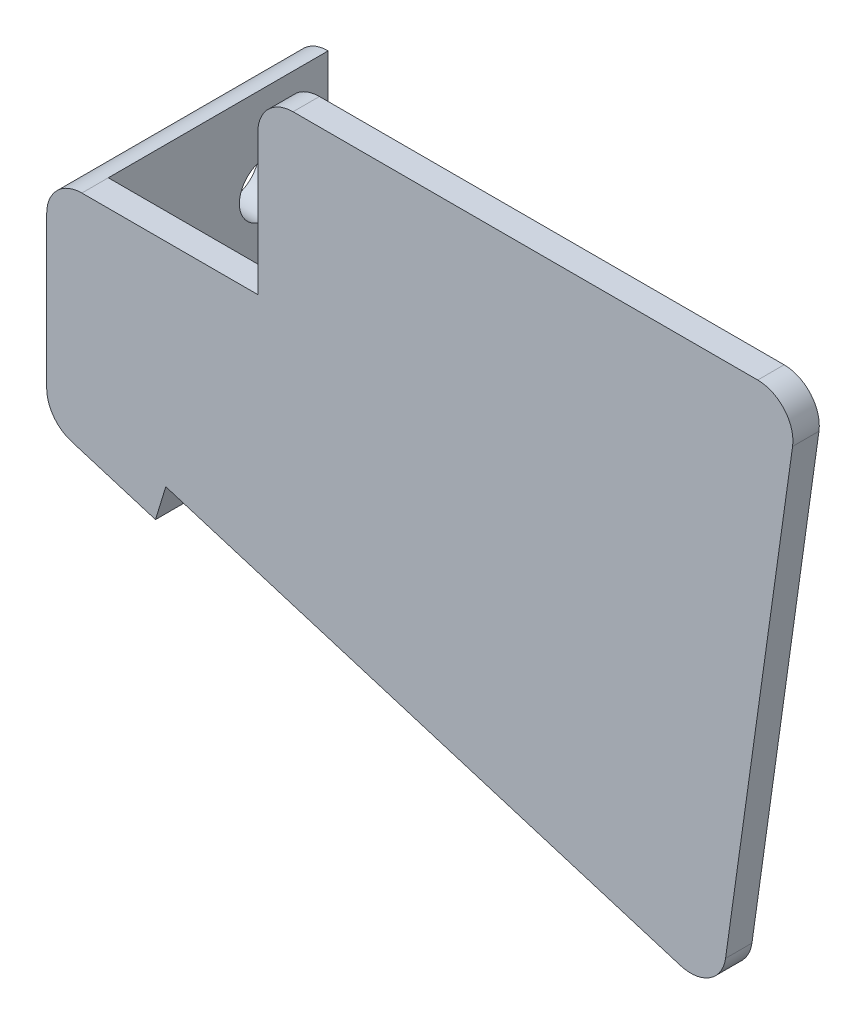
ISO-10303-21;
HEADER;
FILE_DESCRIPTION(('STEP AP214'),'2;1');
FILE_NAME('part.step','',(''),(''),'','','');
FILE_SCHEMA(('AUTOMOTIVE_DESIGN { 1 0 10303 214 1 1 1 1 }'));
ENDSEC;
DATA;
#1=APPLICATION_CONTEXT('core data for automotive mechanical design processes');
#2=APPLICATION_PROTOCOL_DEFINITION('international standard','automotive_design',2000,#1);
#3=PRODUCT_CONTEXT('',#1,'mechanical');
#4=PRODUCT('Part','Part','',(#3));
#5=PRODUCT_RELATED_PRODUCT_CATEGORY('part','',(#4));
#6=PRODUCT_DEFINITION_FORMATION('','',#4);
#7=PRODUCT_DEFINITION_CONTEXT('part definition',#1,'design');
#8=PRODUCT_DEFINITION('design','',#6,#7);
#9=PRODUCT_DEFINITION_SHAPE('','',#8);
#10=(LENGTH_UNIT() NAMED_UNIT(*) SI_UNIT(.MILLI.,.METRE.));
#11=(NAMED_UNIT(*) PLANE_ANGLE_UNIT() SI_UNIT($,.RADIAN.));
#12=(NAMED_UNIT(*) SI_UNIT($,.STERADIAN.) SOLID_ANGLE_UNIT());
#13=UNCERTAINTY_MEASURE_WITH_UNIT(LENGTH_MEASURE(1.E-05),#10,'distance_accuracy_value','');
#14=(GEOMETRIC_REPRESENTATION_CONTEXT(3) GLOBAL_UNCERTAINTY_ASSIGNED_CONTEXT((#13)) GLOBAL_UNIT_ASSIGNED_CONTEXT((#10,
#11,#12)) REPRESENTATION_CONTEXT('',''));
#15=CARTESIAN_POINT('',(0.,0.,0.));
#16=DIRECTION('',(0.,0.,1.));
#17=DIRECTION('',(1.,0.,0.));
#18=AXIS2_PLACEMENT_3D('',#15,#16,#17);
#19=CARTESIAN_POINT('',(-18.1517387774325,-12.72550419017,1.5));
#20=DIRECTION('',(1.,0.,0.));
#21=DIRECTION('',(0.,0.,-1.));
#22=AXIS2_PLACEMENT_3D('',#19,#20,#21);
#23=PLANE('',#22);
#24=CARTESIAN_POINT('',(-18.1517387774325,-17.72550419017,-9.));
#25=DIRECTION('',(1.,0.,0.));
#26=DIRECTION('',(0.,0.,-1.));
#27=AXIS2_PLACEMENT_3D('',#24,#25,#26);
#28=CIRCLE('',#27,1.55);
#29=CARTESIAN_POINT('',(-18.1517387774325,-17.72550419017,-10.55));
#30=VERTEX_POINT('',#29);
#31=EDGE_CURVE('E360',#30,#30,#28,.T.);
#32=ORIENTED_EDGE('',*,*,#31,.T.);
#33=EDGE_LOOP('',(#32));
#34=FACE_BOUND('',#33,.T.);
#35=DIRECTION('',(0.,-1.,0.));
#36=VECTOR('',#35,1.);
#37=CARTESIAN_POINT('',(-18.1517387774325,-12.72550419017,1.5));
#38=LINE('',#37,#36);
#39=CARTESIAN_POINT('',(-18.1517387774325,-14.72550419017,1.5));
#40=VERTEX_POINT('',#39);
#41=CARTESIAN_POINT('',(-18.1517387774325,-23.3369655530873,1.5));
#42=VERTEX_POINT('',#41);
#43=EDGE_CURVE('E199',#40,#42,#38,.T.);
#44=ORIENTED_EDGE('',*,*,#43,.F.);
#45=DIRECTION('',(0.,0.,-1.));
#46=VECTOR('',#45,1.);
#47=CARTESIAN_POINT('',(-18.1517387774325,-14.72550419017,1.5));
#48=LINE('',#47,#46);
#49=CARTESIAN_POINT('',(-18.1517387774325,-14.72550419017,-12.5));
#50=VERTEX_POINT('',#49);
#51=EDGE_CURVE('E252',#40,#50,#48,.T.);
#52=ORIENTED_EDGE('',*,*,#51,.T.);
#53=DIRECTION('',(0.,-1.,0.));
#54=VECTOR('',#53,1.);
#55=CARTESIAN_POINT('',(-18.1517387774325,-12.72550419017,-12.5));
#56=LINE('',#55,#54);
#57=CARTESIAN_POINT('',(-18.1517387774325,-23.3369655530873,-12.5));
#58=VERTEX_POINT('',#57);
#59=EDGE_CURVE('E183',#50,#58,#56,.T.);
#60=ORIENTED_EDGE('',*,*,#59,.T.);
#61=DIRECTION('',(0.,0.,1.));
#62=VECTOR('',#61,1.);
#63=CARTESIAN_POINT('',(-18.1517387774325,-23.3369655530873,1.5));
#64=LINE('',#63,#62);
#65=EDGE_CURVE('E248',#58,#42,#64,.T.);
#66=ORIENTED_EDGE('',*,*,#65,.T.);
#67=EDGE_LOOP('',(#44,#52,#60,#66));
#68=FACE_BOUND('',#67,.T.);
#69=ADVANCED_FACE('F45',(#34,#68),#23,.F.);
#70=CARTESIAN_POINT('',(-18.1517387774325,-22.72550419017,1.5));
#71=DIRECTION('',(0.292371704722734,0.956304755963036,0.));
#72=DIRECTION('',(-0.956304755963036,0.292371704722734,0.));
#73=AXIS2_PLACEMENT_3D('',#70,#71,#72);
#74=PLANE('',#73);
#75=DIRECTION('',(0.956304755963036,-0.292371704722734,0.));
#76=VECTOR('',#75,1.);
#77=CARTESIAN_POINT('',(-18.1517387774325,-22.72550419017,0.));
#78=LINE('',#77,#76);
#79=CARTESIAN_POINT('',(-11.3836912839954,-24.794703962483,0.));
#80=VERTEX_POINT('',#79);
#81=CARTESIAN_POINT('',(17.8610734439076,-33.7357258118429,0.));
#82=VERTEX_POINT('',#81);
#83=EDGE_CURVE('E224',#80,#82,#78,.T.);
#84=ORIENTED_EDGE('',*,*,#83,.T.);
#85=DIRECTION('',(0.,0.,-1.));
#86=VECTOR('',#85,1.);
#87=CARTESIAN_POINT('',(17.8610734439076,-33.7357258118429,1.5));
#88=LINE('',#87,#86);
#89=CARTESIAN_POINT('',(17.8610734439076,-33.7357258118429,1.5));
#90=VERTEX_POINT('',#89);
#91=EDGE_CURVE('E300',#82,#90,#88,.F.);
#92=ORIENTED_EDGE('',*,*,#91,.T.);
#93=DIRECTION('',(0.956304755963036,-0.292371704722734,0.));
#94=VECTOR('',#93,1.);
#95=CARTESIAN_POINT('',(-18.1517387774325,-22.72550419017,1.5));
#96=LINE('',#95,#94);
#97=CARTESIAN_POINT('',(-11.3836912839954,-24.794703962483,1.5));
#98=VERTEX_POINT('',#97);
#99=EDGE_CURVE('E203',#98,#90,#96,.T.);
#100=ORIENTED_EDGE('',*,*,#99,.F.);
#101=DIRECTION('',(0.,0.,1.));
#102=VECTOR('',#101,1.);
#103=CARTESIAN_POINT('',(-11.3836912839954,-24.794703962483,-12.5));
#104=LINE('',#103,#102);
#105=EDGE_CURVE('E188',#80,#98,#104,.T.);
#106=ORIENTED_EDGE('',*,*,#105,.F.);
#107=EDGE_LOOP('',(#84,#92,#100,#106));
#108=FACE_BOUND('',#107,.T.);
#109=ADVANCED_FACE('F397',(#108),#74,.F.);
#110=CARTESIAN_POINT('',(20.100451461089,-34.4203723790793,1.5));
#111=DIRECTION('',(-0.990268068741571,0.139173100960062,0.));
#112=DIRECTION('',(-0.139173100960062,-0.990268068741571,0.));
#113=AXIS2_PLACEMENT_3D('',#110,#111,#112);
#114=PLANE('',#113);
#115=DIRECTION('',(0.139173100960062,0.990268068741571,0.));
#116=VECTOR('',#115,1.);
#117=CARTESIAN_POINT('',(20.100451461089,-34.4203723790793,1.5));
#118=LINE('',#117,#116);
#119=CARTESIAN_POINT('',(20.4263529908362,-32.101462501837,1.5));
#120=VERTEX_POINT('',#119);
#121=CARTESIAN_POINT('',(24.2346740151816,-5.0038503920901,1.5));
#122=VERTEX_POINT('',#121);
#123=EDGE_CURVE('E208',#120,#122,#118,.T.);
#124=ORIENTED_EDGE('',*,*,#123,.F.);
#125=DIRECTION('',(0.,0.,-1.));
#126=VECTOR('',#125,1.);
#127=CARTESIAN_POINT('',(20.4263529908362,-32.101462501837,1.5));
#128=LINE('',#127,#126);
#129=CARTESIAN_POINT('',(20.4263529908362,-32.101462501837,0.));
#130=VERTEX_POINT('',#129);
#131=EDGE_CURVE('E289',#120,#130,#128,.T.);
#132=ORIENTED_EDGE('',*,*,#131,.T.);
#133=DIRECTION('',(0.139173100960062,0.990268068741571,0.));
#134=VECTOR('',#133,1.);
#135=CARTESIAN_POINT('',(20.100451461089,-34.4203723790793,0.));
#136=LINE('',#135,#134);
#137=CARTESIAN_POINT('',(24.2346740151816,-5.0038503920901,0.));
#138=VERTEX_POINT('',#137);
#139=EDGE_CURVE('E229',#130,#138,#136,.T.);
#140=ORIENTED_EDGE('',*,*,#139,.T.);
#141=DIRECTION('',(0.,0.,-1.));
#142=VECTOR('',#141,1.);
#143=CARTESIAN_POINT('',(24.2346740151816,-5.0038503920901,1.5));
#144=LINE('',#143,#142);
#145=EDGE_CURVE('E286',#138,#122,#144,.F.);
#146=ORIENTED_EDGE('',*,*,#145,.T.);
#147=EDGE_LOOP('',(#124,#132,#140,#146));
#148=FACE_BOUND('',#147,.T.);
#149=ADVANCED_FACE('F403',(#148),#114,.F.);
#150=CARTESIAN_POINT('',(-6.15173877743247,-2.72550419016997,1.5));
#151=DIRECTION('',(0.,-1.,0.));
#152=DIRECTION('',(1.,0.,0.));
#153=AXIS2_PLACEMENT_3D('',#150,#151,#152);
#154=PLANE('',#153);
#155=DIRECTION('',(-1.,0.,0.));
#156=VECTOR('',#155,1.);
#157=CARTESIAN_POINT('',(-6.15173877743247,-2.72550419016997,0.));
#158=LINE('',#157,#156);
#159=CARTESIAN_POINT('',(22.2541378776985,-2.72550419016997,0.));
#160=VERTEX_POINT('',#159);
#161=CARTESIAN_POINT('',(-4.15173877743247,-2.72550419016997,0.));
#162=VERTEX_POINT('',#161);
#163=EDGE_CURVE('E233',#160,#162,#158,.T.);
#164=ORIENTED_EDGE('',*,*,#163,.T.);
#165=DIRECTION('',(0.,0.,-1.));
#166=VECTOR('',#165,1.);
#167=CARTESIAN_POINT('',(-4.15173877743247,-2.72550419016997,1.5));
#168=LINE('',#167,#166);
#169=CARTESIAN_POINT('',(-4.15173877743247,-2.72550419016997,1.5));
#170=VERTEX_POINT('',#169);
#171=EDGE_CURVE('E54',#162,#170,#168,.F.);
#172=ORIENTED_EDGE('',*,*,#171,.T.);
#173=DIRECTION('',(-1.,0.,0.));
#174=VECTOR('',#173,1.);
#175=CARTESIAN_POINT('',(-6.15173877743247,-2.72550419016997,1.5));
#176=LINE('',#175,#174);
#177=CARTESIAN_POINT('',(22.2541378776985,-2.72550419016997,1.5));
#178=VERTEX_POINT('',#177);
#179=EDGE_CURVE('E212',#178,#170,#176,.T.);
#180=ORIENTED_EDGE('',*,*,#179,.F.);
#181=DIRECTION('',(0.,0.,-1.));
#182=VECTOR('',#181,1.);
#183=CARTESIAN_POINT('',(22.2541378776985,-2.72550419016997,1.5));
#184=LINE('',#183,#182);
#185=EDGE_CURVE('E307',#178,#160,#184,.T.);
#186=ORIENTED_EDGE('',*,*,#185,.T.);
#187=EDGE_LOOP('',(#164,#172,#180,#186));
#188=FACE_BOUND('',#187,.T.);
#189=ADVANCED_FACE('F314',(#188),#154,.F.);
#190=CARTESIAN_POINT('',(-6.15173877743247,-2.72550419016997,1.5));
#191=DIRECTION('',(1.,0.,0.));
#192=DIRECTION('',(0.,1.,0.));
#193=AXIS2_PLACEMENT_3D('',#190,#191,#192);
#194=PLANE('',#193);
#195=DIRECTION('',(0.,-1.,0.));
#196=VECTOR('',#195,1.);
#197=CARTESIAN_POINT('',(-6.15173877743247,-2.72550419016997,1.5));
#198=LINE('',#197,#196);
#199=CARTESIAN_POINT('',(-6.15173877743247,-4.72550419016997,1.5));
#200=VERTEX_POINT('',#199);
#201=CARTESIAN_POINT('',(-6.15173877743247,-12.72550419017,1.5));
#202=VERTEX_POINT('',#201);
#203=EDGE_CURVE('E216',#200,#202,#198,.T.);
#204=ORIENTED_EDGE('',*,*,#203,.F.);
#205=DIRECTION('',(0.,0.,-1.));
#206=VECTOR('',#205,1.);
#207=CARTESIAN_POINT('',(-6.15173877743247,-4.72550419016997,1.5));
#208=LINE('',#207,#206);
#209=CARTESIAN_POINT('',(-6.15173877743247,-4.72550419016997,0.));
#210=VERTEX_POINT('',#209);
#211=EDGE_CURVE('E303',#200,#210,#208,.T.);
#212=ORIENTED_EDGE('',*,*,#211,.T.);
#213=DIRECTION('',(0.,-1.,0.));
#214=VECTOR('',#213,1.);
#215=CARTESIAN_POINT('',(-6.15173877743247,-2.72550419016997,0.));
#216=LINE('',#215,#214);
#217=CARTESIAN_POINT('',(-6.15173877743247,-12.72550419017,0.));
#218=VERTEX_POINT('',#217);
#219=EDGE_CURVE('E236',#210,#218,#216,.T.);
#220=ORIENTED_EDGE('',*,*,#219,.T.);
#221=DIRECTION('',(0.,0.,-1.));
#222=VECTOR('',#221,1.);
#223=CARTESIAN_POINT('',(-6.15173877743247,-12.72550419017,1.5));
#224=LINE('',#223,#222);
#225=EDGE_CURVE('E223',#202,#218,#224,.T.);
#226=ORIENTED_EDGE('',*,*,#225,.F.);
#227=EDGE_LOOP('',(#204,#212,#220,#226));
#228=FACE_BOUND('',#227,.T.);
#229=ADVANCED_FACE('F325',(#228),#194,.F.);
#230=CARTESIAN_POINT('',(-18.1517387774325,-12.72550419017,1.5));
#231=DIRECTION('',(0.,-1.,0.));
#232=DIRECTION('',(0.,0.,-1.));
#233=AXIS2_PLACEMENT_3D('',#230,#231,#232);
#234=PLANE('',#233);
#235=DIRECTION('',(-1.,0.,0.));
#236=VECTOR('',#235,1.);
#237=CARTESIAN_POINT('',(-18.1517387774325,-12.72550419017,0.));
#238=LINE('',#237,#236);
#239=CARTESIAN_POINT('',(-16.1517387774325,-12.72550419017,0.));
#240=VERTEX_POINT('',#239);
#241=EDGE_CURVE('E204',#218,#240,#238,.T.);
#242=ORIENTED_EDGE('',*,*,#241,.T.);
#243=DIRECTION('',(0.,0.,-1.));
#244=VECTOR('',#243,1.);
#245=CARTESIAN_POINT('',(-16.1517387774325,-12.72550419017,1.5));
#246=LINE('',#245,#244);
#247=CARTESIAN_POINT('',(-16.1517387774325,-12.72550419017,1.5));
#248=VERTEX_POINT('',#247);
#249=EDGE_CURVE('E260',#240,#248,#246,.F.);
#250=ORIENTED_EDGE('',*,*,#249,.T.);
#251=DIRECTION('',(-1.,0.,0.));
#252=VECTOR('',#251,1.);
#253=CARTESIAN_POINT('',(-18.1517387774325,-12.72550419017,1.5));
#254=LINE('',#253,#252);
#255=EDGE_CURVE('E219',#202,#248,#254,.T.);
#256=ORIENTED_EDGE('',*,*,#255,.F.);
#257=ORIENTED_EDGE('',*,*,#225,.T.);
#258=EDGE_LOOP('',(#242,#250,#256,#257));
#259=FACE_BOUND('',#258,.T.);
#260=ADVANCED_FACE('F332',(#259),#234,.F.);
#261=CARTESIAN_POINT('',(0.,0.,1.5));
#262=DIRECTION('',(0.,0.,1.));
#263=DIRECTION('',(1.,0.,0.));
#264=AXIS2_PLACEMENT_3D('',#261,#262,#263);
#265=PLANE('',#264);
#266=ORIENTED_EDGE('',*,*,#255,.T.);
#267=CARTESIAN_POINT('',(-16.1517387774325,-14.72550419017,1.5));
#268=DIRECTION('',(0.,0.,1.));
#269=DIRECTION('',(1.,0.,0.));
#270=AXIS2_PLACEMENT_3D('',#267,#268,#269);
#271=CIRCLE('',#270,2.);
#272=EDGE_CURVE('E275',#248,#40,#271,.T.);
#273=ORIENTED_EDGE('',*,*,#272,.T.);
#274=ORIENTED_EDGE('',*,*,#43,.T.);
#275=CARTESIAN_POINT('',(-16.1517387774325,-23.3369655530873,1.5));
#276=DIRECTION('',(0.,0.,1.));
#277=DIRECTION('',(1.,0.,0.));
#278=AXIS2_PLACEMENT_3D('',#275,#276,#277);
#279=CIRCLE('',#278,2.);
#280=CARTESIAN_POINT('',(-16.7364821868779,-25.2495750650134,1.5));
#281=VERTEX_POINT('',#280);
#282=EDGE_CURVE('E272',#42,#281,#279,.T.);
#283=ORIENTED_EDGE('',*,*,#282,.T.);
#284=DIRECTION('',(0.956304755963036,-0.292371704722735,0.));
#285=VECTOR('',#284,1.);
#286=CARTESIAN_POINT('',(-11.9684346934409,-26.7073134744091,1.5));
#287=LINE('',#286,#285);
#288=CARTESIAN_POINT('',(-11.9684346934409,-26.7073134744091,1.5));
#289=VERTEX_POINT('',#288);
#290=EDGE_CURVE('E355',#281,#289,#287,.T.);
#291=ORIENTED_EDGE('',*,*,#290,.T.);
#292=DIRECTION('',(0.292371704722733,0.956304755963037,0.));
#293=VECTOR('',#292,1.);
#294=CARTESIAN_POINT('',(-11.3836912839954,-24.794703962483,1.5));
#295=LINE('',#294,#293);
#296=EDGE_CURVE('E359',#289,#98,#295,.T.);
#297=ORIENTED_EDGE('',*,*,#296,.T.);
#298=ORIENTED_EDGE('',*,*,#99,.T.);
#299=CARTESIAN_POINT('',(18.4458168533531,-31.8231162999169,1.5));
#300=DIRECTION('',(0.,0.,1.));
#301=DIRECTION('',(1.,0.,0.));
#302=AXIS2_PLACEMENT_3D('',#299,#300,#301);
#303=CIRCLE('',#302,2.);
#304=EDGE_CURVE('E269',#90,#120,#303,.T.);
#305=ORIENTED_EDGE('',*,*,#304,.T.);
#306=ORIENTED_EDGE('',*,*,#123,.T.);
#307=CARTESIAN_POINT('',(22.2541378776985,-4.72550419016997,1.5));
#308=DIRECTION('',(0.,0.,1.));
#309=DIRECTION('',(1.,0.,0.));
#310=AXIS2_PLACEMENT_3D('',#307,#308,#309);
#311=CIRCLE('',#310,2.);
#312=EDGE_CURVE('E263',#122,#178,#311,.T.);
#313=ORIENTED_EDGE('',*,*,#312,.T.);
#314=ORIENTED_EDGE('',*,*,#179,.T.);
#315=CARTESIAN_POINT('',(-4.15173877743247,-4.72550419016997,1.5));
#316=DIRECTION('',(0.,0.,1.));
#317=DIRECTION('',(1.,0.,0.));
#318=AXIS2_PLACEMENT_3D('',#315,#316,#317);
#319=CIRCLE('',#318,2.);
#320=EDGE_CURVE('E266',#170,#200,#319,.T.);
#321=ORIENTED_EDGE('',*,*,#320,.T.);
#322=ORIENTED_EDGE('',*,*,#203,.T.);
#323=EDGE_LOOP('',(#266,#273,#274,#283,#291,#297,#298,#305,#306,#313,#314,#321,#322));
#324=FACE_BOUND('',#323,.T.);
#325=ADVANCED_FACE('F319',(#324),#265,.T.);
#326=CARTESIAN_POINT('',(0.,0.,0.));
#327=DIRECTION('',(0.,0.,1.));
#328=DIRECTION('',(1.,0.,0.));
#329=AXIS2_PLACEMENT_3D('',#326,#327,#328);
#330=PLANE('',#329);
#331=ORIENTED_EDGE('',*,*,#139,.F.);
#332=CARTESIAN_POINT('',(18.4458168533531,-31.8231162999169,0.));
#333=DIRECTION('',(0.,0.,1.));
#334=DIRECTION('',(1.,0.,0.));
#335=AXIS2_PLACEMENT_3D('',#332,#333,#334);
#336=CIRCLE('',#335,2.);
#337=EDGE_CURVE('E61',#130,#82,#336,.F.);
#338=ORIENTED_EDGE('',*,*,#337,.T.);
#339=ORIENTED_EDGE('',*,*,#83,.F.);
#340=DIRECTION('',(0.292371704722733,0.956304755963037,0.));
#341=VECTOR('',#340,1.);
#342=CARTESIAN_POINT('',(-3.47808828665833,1.06335830205342,0.));
#343=LINE('',#342,#341);
#344=CARTESIAN_POINT('',(-11.9684346934409,-26.7073134744091,0.));
#345=VERTEX_POINT('',#344);
#346=EDGE_CURVE('E278',#345,#80,#343,.T.);
#347=ORIENTED_EDGE('',*,*,#346,.F.);
#348=CARTESIAN_POINT('',(-13.881044205367,-26.1225700649636,0.));
#349=DIRECTION('',(0.,0.,1.));
#350=DIRECTION('',(1.,0.,0.));
#351=AXIS2_PLACEMENT_3D('',#348,#349,#350);
#352=CIRCLE('',#351,2.);
#353=CARTESIAN_POINT('',(-13.2963007959215,-24.2099605530376,0.));
#354=VERTEX_POINT('',#353);
#355=EDGE_CURVE('E11',#345,#354,#352,.T.);
#356=ORIENTED_EDGE('',*,*,#355,.T.);
#357=CARTESIAN_POINT('',(-16.1517387774325,-23.3369655530873,0.));
#358=VERTEX_POINT('',#357);
#359=EDGE_CURVE('E227',#358,#354,#78,.T.);
#360=ORIENTED_EDGE('',*,*,#359,.F.);
#361=DIRECTION('',(0.,1.,0.));
#362=VECTOR('',#361,1.);
#363=CARTESIAN_POINT('',(-16.1517387774325,0.,0.));
#364=LINE('',#363,#362);
#365=EDGE_CURVE('E245',#358,#240,#364,.T.);
#366=ORIENTED_EDGE('',*,*,#365,.T.);
#367=ORIENTED_EDGE('',*,*,#241,.F.);
#368=ORIENTED_EDGE('',*,*,#219,.F.);
#369=CARTESIAN_POINT('',(-4.15173877743247,-4.72550419016997,0.));
#370=DIRECTION('',(0.,0.,1.));
#371=DIRECTION('',(1.,0.,0.));
#372=AXIS2_PLACEMENT_3D('',#369,#370,#371);
#373=CIRCLE('',#372,2.);
#374=EDGE_CURVE('E68',#210,#162,#373,.F.);
#375=ORIENTED_EDGE('',*,*,#374,.T.);
#376=ORIENTED_EDGE('',*,*,#163,.F.);
#377=CARTESIAN_POINT('',(22.2541378776985,-4.72550419016997,0.));
#378=DIRECTION('',(0.,0.,1.));
#379=DIRECTION('',(1.,0.,0.));
#380=AXIS2_PLACEMENT_3D('',#377,#378,#379);
#381=CIRCLE('',#380,2.);
#382=EDGE_CURVE('E293',#160,#138,#381,.F.);
#383=ORIENTED_EDGE('',*,*,#382,.T.);
#384=EDGE_LOOP('',(#331,#338,#339,#347,#356,#360,#366,#367,#368,#375,#376,#383));
#385=FACE_BOUND('',#384,.T.);
#386=ADVANCED_FACE('F328',(#385),#330,.F.);
#387=CARTESIAN_POINT('',(-16.1517387774325,-12.72550419017,-12.5));
#388=DIRECTION('',(1.,0.,0.));
#389=DIRECTION('',(0.,0.,-1.));
#390=AXIS2_PLACEMENT_3D('',#387,#388,#389);
#391=PLANE('',#390);
#392=CARTESIAN_POINT('',(-16.1517387774325,-17.72550419017,-9.));
#393=DIRECTION('',(1.,0.,0.));
#394=DIRECTION('',(0.,0.,-1.));
#395=AXIS2_PLACEMENT_3D('',#392,#393,#394);
#396=CIRCLE('',#395,1.55);
#397=CARTESIAN_POINT('',(-16.1517387774325,-17.72550419017,-10.55));
#398=VERTEX_POINT('',#397);
#399=EDGE_CURVE('E366',#398,#398,#396,.T.);
#400=ORIENTED_EDGE('',*,*,#399,.F.);
#401=EDGE_LOOP('',(#400));
#402=FACE_BOUND('',#401,.T.);
#403=ORIENTED_EDGE('',*,*,#365,.F.);
#404=DIRECTION('',(0.,0.,1.));
#405=VECTOR('',#404,1.);
#406=CARTESIAN_POINT('',(-16.1517387774325,-23.3369655530873,-12.5));
#407=LINE('',#406,#405);
#408=CARTESIAN_POINT('',(-16.1517387774325,-23.3369655530873,-12.5));
#409=VERTEX_POINT('',#408);
#410=EDGE_CURVE('E194',#409,#358,#407,.T.);
#411=ORIENTED_EDGE('',*,*,#410,.F.);
#412=DIRECTION('',(0.,1.,0.));
#413=VECTOR('',#412,1.);
#414=CARTESIAN_POINT('',(-16.1517387774325,-12.72550419017,-12.5));
#415=LINE('',#414,#413);
#416=CARTESIAN_POINT('',(-16.1517387774325,-12.72550419017,-12.5));
#417=VERTEX_POINT('',#416);
#418=EDGE_CURVE('E196',#409,#417,#415,.T.);
#419=ORIENTED_EDGE('',*,*,#418,.T.);
#420=DIRECTION('',(0.,0.,1.));
#421=VECTOR('',#420,1.);
#422=CARTESIAN_POINT('',(-16.1517387774325,-12.72550419017,-12.5));
#423=LINE('',#422,#421);
#424=EDGE_CURVE('E228',#417,#240,#423,.T.);
#425=ORIENTED_EDGE('',*,*,#424,.T.);
#426=EDGE_LOOP('',(#403,#411,#419,#425));
#427=FACE_BOUND('',#426,.T.);
#428=ADVANCED_FACE('F338',(#402,#427),#391,.T.);
#429=CARTESIAN_POINT('',(-16.1517387774325,-23.3369655530873,-12.5));
#430=DIRECTION('',(0.292371704722733,0.956304755963036,0.));
#431=DIRECTION('',(-0.956304755963037,0.292371704722733,0.));
#432=AXIS2_PLACEMENT_3D('',#429,#430,#431);
#433=PLANE('',#432);
#434=ORIENTED_EDGE('',*,*,#359,.T.);
#435=DIRECTION('',(0.,0.,1.));
#436=VECTOR('',#435,1.);
#437=CARTESIAN_POINT('',(-13.2963007959215,-24.2099605530376,-12.5));
#438=LINE('',#437,#436);
#439=CARTESIAN_POINT('',(-13.2963007959215,-24.2099605530376,-12.5));
#440=VERTEX_POINT('',#439);
#441=EDGE_CURVE('E281',#354,#440,#438,.F.);
#442=ORIENTED_EDGE('',*,*,#441,.T.);
#443=DIRECTION('',(-0.956304755963036,0.292371704722733,0.));
#444=VECTOR('',#443,1.);
#445=CARTESIAN_POINT('',(-16.1517387774325,-23.3369655530873,-12.5));
#446=LINE('',#445,#444);
#447=EDGE_CURVE('E167',#440,#409,#446,.T.);
#448=ORIENTED_EDGE('',*,*,#447,.T.);
#449=ORIENTED_EDGE('',*,*,#410,.T.);
#450=EDGE_LOOP('',(#434,#442,#448,#449));
#451=FACE_BOUND('',#450,.T.);
#452=ADVANCED_FACE('F373',(#451),#433,.T.);
#453=CARTESIAN_POINT('',(-11.3836912839954,-24.794703962483,-12.5));
#454=DIRECTION('',(0.956304755963037,-0.292371704722733,0.));
#455=DIRECTION('',(0.292371704722733,0.956304755963037,0.));
#456=AXIS2_PLACEMENT_3D('',#453,#454,#455);
#457=PLANE('',#456);
#458=DIRECTION('',(0.,0.,1.));
#459=VECTOR('',#458,1.);
#460=CARTESIAN_POINT('',(-11.9684346934409,-26.7073134744091,-12.5));
#461=LINE('',#460,#459);
#462=EDGE_CURVE('E189',#345,#289,#461,.T.);
#463=ORIENTED_EDGE('',*,*,#462,.F.);
#464=ORIENTED_EDGE('',*,*,#346,.T.);
#465=ORIENTED_EDGE('',*,*,#105,.T.);
#466=ORIENTED_EDGE('',*,*,#296,.F.);
#467=EDGE_LOOP('',(#463,#464,#465,#466));
#468=FACE_BOUND('',#467,.T.);
#469=ADVANCED_FACE('F392',(#468),#457,.T.);
#470=CARTESIAN_POINT('',(-11.9684346934409,-26.7073134744091,-12.5));
#471=DIRECTION('',(-0.292371704722735,-0.956304755963036,0.));
#472=DIRECTION('',(0.956304755963036,-0.292371704722735,0.));
#473=AXIS2_PLACEMENT_3D('',#470,#471,#472);
#474=PLANE('',#473);
#475=ORIENTED_EDGE('',*,*,#290,.F.);
#476=DIRECTION('',(0.,0.,1.));
#477=VECTOR('',#476,1.);
#478=CARTESIAN_POINT('',(-16.7364821868779,-25.2495750650134,-12.5));
#479=LINE('',#478,#477);
#480=CARTESIAN_POINT('',(-16.7364821868779,-25.2495750650134,-12.5));
#481=VERTEX_POINT('',#480);
#482=EDGE_CURVE('E181',#281,#481,#479,.F.);
#483=ORIENTED_EDGE('',*,*,#482,.T.);
#484=DIRECTION('',(0.956304755963036,-0.292371704722735,0.));
#485=VECTOR('',#484,1.);
#486=CARTESIAN_POINT('',(-11.9684346934409,-26.7073134744091,-12.5));
#487=LINE('',#486,#485);
#488=CARTESIAN_POINT('',(-11.9684346934409,-26.7073134744091,-12.5));
#489=VERTEX_POINT('',#488);
#490=EDGE_CURVE('E164',#481,#489,#487,.T.);
#491=ORIENTED_EDGE('',*,*,#490,.T.);
#492=EDGE_CURVE('E179',#489,#345,#461,.T.);
#493=ORIENTED_EDGE('',*,*,#492,.T.);
#494=ORIENTED_EDGE('',*,*,#462,.T.);
#495=EDGE_LOOP('',(#475,#483,#491,#493,#494));
#496=FACE_BOUND('',#495,.T.);
#497=ADVANCED_FACE('F178',(#496),#474,.T.);
#498=CARTESIAN_POINT('',(0.,0.,-12.5));
#499=DIRECTION('',(0.,0.,1.));
#500=DIRECTION('',(1.,0.,0.));
#501=AXIS2_PLACEMENT_3D('',#498,#499,#500);
#502=PLANE('',#501);
#503=ORIENTED_EDGE('',*,*,#59,.F.);
#504=CARTESIAN_POINT('',(-16.1517387774325,-14.72550419017,-12.5));
#505=DIRECTION('',(0.,0.,1.));
#506=DIRECTION('',(1.,0.,0.));
#507=AXIS2_PLACEMENT_3D('',#504,#505,#506);
#508=CIRCLE('',#507,2.);
#509=EDGE_CURVE('E172',#50,#417,#508,.F.);
#510=ORIENTED_EDGE('',*,*,#509,.T.);
#511=ORIENTED_EDGE('',*,*,#418,.F.);
#512=ORIENTED_EDGE('',*,*,#447,.F.);
#513=CARTESIAN_POINT('',(-13.881044205367,-26.1225700649636,-12.5));
#514=DIRECTION('',(0.,0.,1.));
#515=DIRECTION('',(1.,0.,0.));
#516=AXIS2_PLACEMENT_3D('',#513,#514,#515);
#517=CIRCLE('',#516,2.);
#518=EDGE_CURVE('E160',#440,#489,#517,.F.);
#519=ORIENTED_EDGE('',*,*,#518,.T.);
#520=ORIENTED_EDGE('',*,*,#490,.F.);
#521=CARTESIAN_POINT('',(-16.1517387774325,-23.3369655530873,-12.5));
#522=DIRECTION('',(0.,0.,1.));
#523=DIRECTION('',(1.,0.,0.));
#524=AXIS2_PLACEMENT_3D('',#521,#522,#523);
#525=CIRCLE('',#524,2.);
#526=EDGE_CURVE('E173',#481,#58,#525,.F.);
#527=ORIENTED_EDGE('',*,*,#526,.T.);
#528=EDGE_LOOP('',(#503,#510,#511,#512,#519,#520,#527));
#529=FACE_BOUND('',#528,.T.);
#530=ADVANCED_FACE('F163',(#529),#502,.F.);
#531=CARTESIAN_POINT('',(-30.1517387774325,-17.72550419017,-9.));
#532=DIRECTION('',(1.,0.,0.));
#533=DIRECTION('',(0.,0.,-1.));
#534=AXIS2_PLACEMENT_3D('',#531,#532,#533);
#535=CYLINDRICAL_SURFACE('',#534,1.55);
#536=ORIENTED_EDGE('',*,*,#399,.T.);
#537=EDGE_LOOP('',(#536));
#538=FACE_BOUND('',#537,.T.);
#539=ORIENTED_EDGE('',*,*,#31,.F.);
#540=EDGE_LOOP('',(#539));
#541=FACE_BOUND('',#540,.T.);
#542=ADVANCED_FACE('F383',(#538,#541),#535,.F.);
#543=CARTESIAN_POINT('',(-16.1517387774325,-14.72550419017,1.5));
#544=DIRECTION('',(0.,0.,-1.));
#545=DIRECTION('',(-1.,0.,0.));
#546=AXIS2_PLACEMENT_3D('',#543,#544,#545);
#547=CYLINDRICAL_SURFACE('',#546,2.);
#548=ORIENTED_EDGE('',*,*,#249,.F.);
#549=ORIENTED_EDGE('',*,*,#424,.F.);
#550=ORIENTED_EDGE('',*,*,#509,.F.);
#551=ORIENTED_EDGE('',*,*,#51,.F.);
#552=ORIENTED_EDGE('',*,*,#272,.F.);
#553=EDGE_LOOP('',(#548,#549,#550,#551,#552));
#554=FACE_BOUND('',#553,.T.);
#555=ADVANCED_FACE('F345',(#554),#547,.T.);
#556=CARTESIAN_POINT('',(-13.881044205367,-26.1225700649636,-12.5));
#557=DIRECTION('',(0.,0.,1.));
#558=DIRECTION('',(1.,0.,0.));
#559=AXIS2_PLACEMENT_3D('',#556,#557,#558);
#560=CYLINDRICAL_SURFACE('',#559,2.);
#561=ORIENTED_EDGE('',*,*,#518,.F.);
#562=ORIENTED_EDGE('',*,*,#441,.F.);
#563=ORIENTED_EDGE('',*,*,#355,.F.);
#564=ORIENTED_EDGE('',*,*,#492,.F.);
#565=EDGE_LOOP('',(#561,#562,#563,#564));
#566=FACE_BOUND('',#565,.T.);
#567=ADVANCED_FACE('F185',(#566),#560,.T.);
#568=CARTESIAN_POINT('',(-16.1517387774325,-23.3369655530873,1.5));
#569=DIRECTION('',(0.,0.,-1.));
#570=DIRECTION('',(-1.,0.,0.));
#571=AXIS2_PLACEMENT_3D('',#568,#569,#570);
#572=CYLINDRICAL_SURFACE('',#571,2.);
#573=ORIENTED_EDGE('',*,*,#526,.F.);
#574=ORIENTED_EDGE('',*,*,#482,.F.);
#575=ORIENTED_EDGE('',*,*,#282,.F.);
#576=ORIENTED_EDGE('',*,*,#65,.F.);
#577=EDGE_LOOP('',(#573,#574,#575,#576));
#578=FACE_BOUND('',#577,.T.);
#579=ADVANCED_FACE('F352',(#578),#572,.T.);
#580=CARTESIAN_POINT('',(18.4458168533531,-31.8231162999169,1.5));
#581=DIRECTION('',(0.,0.,-1.));
#582=DIRECTION('',(-1.,0.,0.));
#583=AXIS2_PLACEMENT_3D('',#580,#581,#582);
#584=CYLINDRICAL_SURFACE('',#583,2.);
#585=ORIENTED_EDGE('',*,*,#304,.F.);
#586=ORIENTED_EDGE('',*,*,#91,.F.);
#587=ORIENTED_EDGE('',*,*,#337,.F.);
#588=ORIENTED_EDGE('',*,*,#131,.F.);
#589=EDGE_LOOP('',(#585,#586,#587,#588));
#590=FACE_BOUND('',#589,.T.);
#591=ADVANCED_FACE('F414',(#590),#584,.T.);
#592=CARTESIAN_POINT('',(-4.15173877743247,-4.72550419016997,1.5));
#593=DIRECTION('',(0.,0.,-1.));
#594=DIRECTION('',(-1.,0.,0.));
#595=AXIS2_PLACEMENT_3D('',#592,#593,#594);
#596=CYLINDRICAL_SURFACE('',#595,2.);
#597=ORIENTED_EDGE('',*,*,#320,.F.);
#598=ORIENTED_EDGE('',*,*,#171,.F.);
#599=ORIENTED_EDGE('',*,*,#374,.F.);
#600=ORIENTED_EDGE('',*,*,#211,.F.);
#601=EDGE_LOOP('',(#597,#598,#599,#600));
#602=FACE_BOUND('',#601,.T.);
#603=ADVANCED_FACE('F323',(#602),#596,.T.);
#604=CARTESIAN_POINT('',(22.2541378776985,-4.72550419016997,1.5));
#605=DIRECTION('',(0.,0.,-1.));
#606=DIRECTION('',(-1.,0.,0.));
#607=AXIS2_PLACEMENT_3D('',#604,#605,#606);
#608=CYLINDRICAL_SURFACE('',#607,2.);
#609=ORIENTED_EDGE('',*,*,#312,.F.);
#610=ORIENTED_EDGE('',*,*,#145,.F.);
#611=ORIENTED_EDGE('',*,*,#382,.F.);
#612=ORIENTED_EDGE('',*,*,#185,.F.);
#613=EDGE_LOOP('',(#609,#610,#611,#612));
#614=FACE_BOUND('',#613,.T.);
#615=ADVANCED_FACE('F47',(#614),#608,.T.);
#616=CLOSED_SHELL('',(#69,#109,#149,#189,#229,#260,#325,#386,#428,#452,#469,#497,#530,#542,#555,
#567,#579,#591,#603,#615));
#617=MANIFOLD_SOLID_BREP('B2',#616);
#618=ADVANCED_BREP_SHAPE_REPRESENTATION('',(#18,#617),#14);
#619=SHAPE_DEFINITION_REPRESENTATION(#9,#618);
ENDSEC;
END-ISO-10303-21;
